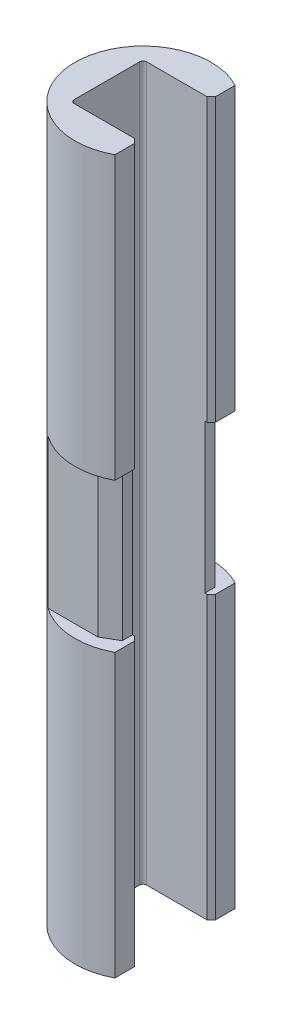
ISO-10303-21;
HEADER;
FILE_DESCRIPTION(('STEP AP214'),'2;1');
FILE_NAME('part.step','',(''),(''),'','','');
FILE_SCHEMA(('AUTOMOTIVE_DESIGN { 1 0 10303 214 1 1 1 1 }'));
ENDSEC;
DATA;
#1=APPLICATION_CONTEXT('core data for automotive mechanical design processes');
#2=APPLICATION_PROTOCOL_DEFINITION('international standard','automotive_design',2000,#1);
#3=PRODUCT_CONTEXT('',#1,'mechanical');
#4=PRODUCT('Part','Part','',(#3));
#5=PRODUCT_RELATED_PRODUCT_CATEGORY('part','',(#4));
#6=PRODUCT_DEFINITION_FORMATION('','',#4);
#7=PRODUCT_DEFINITION_CONTEXT('part definition',#1,'design');
#8=PRODUCT_DEFINITION('design','',#6,#7);
#9=PRODUCT_DEFINITION_SHAPE('','',#8);
#10=(LENGTH_UNIT() NAMED_UNIT(*) SI_UNIT(.MILLI.,.METRE.));
#11=(NAMED_UNIT(*) PLANE_ANGLE_UNIT() SI_UNIT($,.RADIAN.));
#12=(NAMED_UNIT(*) SI_UNIT($,.STERADIAN.) SOLID_ANGLE_UNIT());
#13=UNCERTAINTY_MEASURE_WITH_UNIT(LENGTH_MEASURE(1.E-05),#10,'distance_accuracy_value','');
#14=(GEOMETRIC_REPRESENTATION_CONTEXT(3) GLOBAL_UNCERTAINTY_ASSIGNED_CONTEXT((#13)) GLOBAL_UNIT_ASSIGNED_CONTEXT((#10,
#11,#12)) REPRESENTATION_CONTEXT('',''));
#15=CARTESIAN_POINT('',(0.,0.,0.));
#16=DIRECTION('',(0.,0.,1.));
#17=DIRECTION('',(1.,0.,0.));
#18=AXIS2_PLACEMENT_3D('',#15,#16,#17);
#19=CARTESIAN_POINT('',(-3.6,13.5,1.939059892));
#20=DIRECTION('',(-1.,0.,0.));
#21=DIRECTION('',(0.,0.,1.));
#22=AXIS2_PLACEMENT_3D('',#19,#20,#21);
#23=PLANE('',#22);
#24=DIRECTION('',(0.,1.,0.));
#25=VECTOR('',#24,1.);
#26=CARTESIAN_POINT('',(-3.6,13.5,2.178119784));
#27=LINE('',#26,#25);
#28=CARTESIAN_POINT('',(-3.6,20.5,2.178119784));
#29=VERTEX_POINT('',#28);
#30=CARTESIAN_POINT('',(-3.6,13.5,2.178119784));
#31=VERTEX_POINT('',#30);
#32=EDGE_CURVE('E262',#29,#31,#27,.F.);
#33=ORIENTED_EDGE('',*,*,#32,.T.);
#34=DIRECTION('',(0.,0.,1.));
#35=VECTOR('',#34,1.);
#36=CARTESIAN_POINT('',(-3.6,13.5,1.939059892));
#37=LINE('',#36,#35);
#38=CARTESIAN_POINT('',(-3.6,13.5,1.70000000233333));
#39=VERTEX_POINT('',#38);
#40=EDGE_CURVE('E194',#39,#31,#37,.T.);
#41=ORIENTED_EDGE('',*,*,#40,.F.);
#42=DIRECTION('',(0.,1.,0.));
#43=VECTOR('',#42,1.);
#44=CARTESIAN_POINT('',(-3.6,0.25,1.700000004));
#45=LINE('',#44,#43);
#46=CARTESIAN_POINT('',(-3.6,20.5,1.70000000133333));
#47=VERTEX_POINT('',#46);
#48=EDGE_CURVE('E220',#47,#39,#45,.F.);
#49=ORIENTED_EDGE('',*,*,#48,.F.);
#50=DIRECTION('',(0.,0.,1.));
#51=VECTOR('',#50,1.);
#52=CARTESIAN_POINT('',(-3.6,20.5,1.939059892));
#53=LINE('',#52,#51);
#54=EDGE_CURVE('E231',#29,#47,#53,.F.);
#55=ORIENTED_EDGE('',*,*,#54,.F.);
#56=EDGE_LOOP('',(#33,#41,#49,#55));
#57=FACE_BOUND('',#56,.T.);
#58=ADVANCED_FACE('F16',(#57),#23,.F.);
#59=CARTESIAN_POINT('',(-3.4,0.25,-1.8));
#60=DIRECTION('',(0.707106781186548,0.,0.707106781186548));
#61=DIRECTION('',(0.707106781186548,0.,-0.707106781186548));
#62=AXIS2_PLACEMENT_3D('',#59,#60,#61);
#63=PLANE('',#62);
#64=DIRECTION('',(0.707106781186548,0.,-0.707106781186548));
#65=VECTOR('',#64,1.);
#66=CARTESIAN_POINT('',(-3.4,33.75,-1.8));
#67=LINE('',#66,#65);
#68=CARTESIAN_POINT('',(-3.3,33.75,-1.9));
#69=VERTEX_POINT('',#68);
#70=CARTESIAN_POINT('',(-3.5,33.75,-1.7));
#71=VERTEX_POINT('',#70);
#72=EDGE_CURVE('E355',#69,#71,#67,.F.);
#73=ORIENTED_EDGE('',*,*,#72,.T.);
#74=DIRECTION('',(0.,1.,0.));
#75=VECTOR('',#74,1.);
#76=CARTESIAN_POINT('',(-3.5,0.25,-1.7));
#77=LINE('',#76,#75);
#78=CARTESIAN_POINT('',(-3.5,20.5,-1.7));
#79=VERTEX_POINT('',#78);
#80=EDGE_CURVE('E371',#79,#71,#77,.T.);
#81=ORIENTED_EDGE('',*,*,#80,.F.);
#82=DIRECTION('',(-0.707106781186548,0.,0.707106781186548));
#83=VECTOR('',#82,1.);
#84=CARTESIAN_POINT('',(-3.3,20.5,-1.9));
#85=LINE('',#84,#83);
#86=CARTESIAN_POINT('',(-3.3,20.5,-1.9));
#87=VERTEX_POINT('',#86);
#88=EDGE_CURVE('E312',#87,#79,#85,.T.);
#89=ORIENTED_EDGE('',*,*,#88,.F.);
#90=DIRECTION('',(0.,1.,0.));
#91=VECTOR('',#90,1.);
#92=CARTESIAN_POINT('',(-3.3,0.25,-1.9));
#93=LINE('',#92,#91);
#94=EDGE_CURVE('E349',#69,#87,#93,.F.);
#95=ORIENTED_EDGE('',*,*,#94,.F.);
#96=EDGE_LOOP('',(#73,#81,#89,#95));
#97=FACE_BOUND('',#96,.T.);
#98=ADVANCED_FACE('F536',(#97),#63,.T.);
#99=CARTESIAN_POINT('',(-3.4,0.25,-1.8));
#100=DIRECTION('',(0.707106781186548,0.,0.707106781186548));
#101=DIRECTION('',(0.707106781186548,0.,-0.707106781186548));
#102=AXIS2_PLACEMENT_3D('',#99,#100,#101);
#103=PLANE('',#102);
#104=DIRECTION('',(0.707106781186548,0.,-0.707106781186548));
#105=VECTOR('',#104,1.);
#106=CARTESIAN_POINT('',(-3.4,0.25,-1.8));
#107=LINE('',#106,#105);
#108=CARTESIAN_POINT('',(-3.5,0.25,-1.7));
#109=VERTEX_POINT('',#108);
#110=CARTESIAN_POINT('',(-3.3,0.25,-1.9));
#111=VERTEX_POINT('',#110);
#112=EDGE_CURVE('E353',#109,#111,#107,.T.);
#113=ORIENTED_EDGE('',*,*,#112,.T.);
#114=DIRECTION('',(0.,1.,0.));
#115=VECTOR('',#114,1.);
#116=CARTESIAN_POINT('',(-3.3,0.25,-1.9));
#117=LINE('',#116,#115);
#118=CARTESIAN_POINT('',(-3.3,13.5,-1.9));
#119=VERTEX_POINT('',#118);
#120=EDGE_CURVE('E300',#119,#111,#117,.F.);
#121=ORIENTED_EDGE('',*,*,#120,.F.);
#122=DIRECTION('',(-0.707106781186548,0.,0.707106781186548));
#123=VECTOR('',#122,1.);
#124=CARTESIAN_POINT('',(-3.3,13.5,-1.9));
#125=LINE('',#124,#123);
#126=CARTESIAN_POINT('',(-3.5,13.5,-1.7));
#127=VERTEX_POINT('',#126);
#128=EDGE_CURVE('E329',#119,#127,#125,.T.);
#129=ORIENTED_EDGE('',*,*,#128,.T.);
#130=DIRECTION('',(0.,1.,0.));
#131=VECTOR('',#130,1.);
#132=CARTESIAN_POINT('',(-3.5,0.25,-1.7));
#133=LINE('',#132,#131);
#134=EDGE_CURVE('E283',#109,#127,#133,.T.);
#135=ORIENTED_EDGE('',*,*,#134,.F.);
#136=EDGE_LOOP('',(#113,#121,#129,#135));
#137=FACE_BOUND('',#136,.T.);
#138=ADVANCED_FACE('F541',(#137),#103,.T.);
#139=CARTESIAN_POINT('',(-3.6,13.5,-1.939059892));
#140=DIRECTION('',(-1.,0.,0.));
#141=DIRECTION('',(0.,0.,1.));
#142=AXIS2_PLACEMENT_3D('',#139,#140,#141);
#143=PLANE('',#142);
#144=DIRECTION('',(0.,1.,0.));
#145=VECTOR('',#144,1.);
#146=CARTESIAN_POINT('',(-3.6,0.25,-1.7));
#147=LINE('',#146,#145);
#148=CARTESIAN_POINT('',(-3.6,13.5,-1.7));
#149=VERTEX_POINT('',#148);
#150=CARTESIAN_POINT('',(-3.6,20.5,-1.7));
#151=VERTEX_POINT('',#150);
#152=EDGE_CURVE('E360',#149,#151,#147,.T.);
#153=ORIENTED_EDGE('',*,*,#152,.F.);
#154=DIRECTION('',(0.,0.,-1.));
#155=VECTOR('',#154,1.);
#156=CARTESIAN_POINT('',(-3.6,13.5,0.0499443220148729));
#157=LINE('',#156,#155);
#158=CARTESIAN_POINT('',(-3.6,13.5,-2.178119784));
#159=VERTEX_POINT('',#158);
#160=EDGE_CURVE('E343',#149,#159,#157,.T.);
#161=ORIENTED_EDGE('',*,*,#160,.T.);
#162=DIRECTION('',(0.,1.,0.));
#163=VECTOR('',#162,1.);
#164=CARTESIAN_POINT('',(-3.6,13.5,-2.178119784));
#165=LINE('',#164,#163);
#166=CARTESIAN_POINT('',(-3.6,20.5,-2.178119784));
#167=VERTEX_POINT('',#166);
#168=EDGE_CURVE('E313',#159,#167,#165,.T.);
#169=ORIENTED_EDGE('',*,*,#168,.T.);
#170=DIRECTION('',(0.,0.,-1.));
#171=VECTOR('',#170,1.);
#172=CARTESIAN_POINT('',(-3.6,20.5,0.0499443220148729));
#173=LINE('',#172,#171);
#174=EDGE_CURVE('E330',#151,#167,#173,.T.);
#175=ORIENTED_EDGE('',*,*,#174,.F.);
#176=EDGE_LOOP('',(#153,#161,#169,#175));
#177=FACE_BOUND('',#176,.T.);
#178=ADVANCED_FACE('F620',(#177),#143,.F.);
#179=CARTESIAN_POINT('',(-6.34,0.25,1.540000004));
#180=DIRECTION('',(0.,1.,0.));
#181=DIRECTION('',(0.,0.,1.));
#182=AXIS2_PLACEMENT_3D('',#179,#180,#181);
#183=CYLINDRICAL_SURFACE('',#182,0.159999999999999);
#184=DIRECTION('',(0.,1.,0.));
#185=VECTOR('',#184,1.);
#186=CARTESIAN_POINT('',(-6.34,0.25,1.700000004));
#187=LINE('',#186,#185);
#188=CARTESIAN_POINT('',(-6.34,0.25,1.700000004));
#189=VERTEX_POINT('',#188);
#190=CARTESIAN_POINT('',(-6.34,33.75,1.700000004));
#191=VERTEX_POINT('',#190);
#192=EDGE_CURVE('E221',#189,#191,#187,.T.);
#193=ORIENTED_EDGE('',*,*,#192,.F.);
#194=CARTESIAN_POINT('',(-6.34,0.25,1.540000004));
#195=DIRECTION('',(0.,1.,0.));
#196=DIRECTION('',(0.,0.,1.));
#197=AXIS2_PLACEMENT_3D('',#194,#195,#196);
#198=CIRCLE('',#197,0.159999999999999);
#199=CARTESIAN_POINT('',(-6.5,0.25,1.540000004));
#200=VERTEX_POINT('',#199);
#201=EDGE_CURVE('E19',#200,#189,#198,.T.);
#202=ORIENTED_EDGE('',*,*,#201,.F.);
#203=DIRECTION('',(0.,1.,0.));
#204=VECTOR('',#203,1.);
#205=CARTESIAN_POINT('',(-6.5,0.25,1.540000004));
#206=LINE('',#205,#204);
#207=CARTESIAN_POINT('',(-6.5,33.75,1.540000004));
#208=VERTEX_POINT('',#207);
#209=EDGE_CURVE('E383',#208,#200,#206,.F.);
#210=ORIENTED_EDGE('',*,*,#209,.F.);
#211=CARTESIAN_POINT('',(-6.34,33.75,1.540000004));
#212=DIRECTION('',(0.,1.,0.));
#213=DIRECTION('',(0.,0.,1.));
#214=AXIS2_PLACEMENT_3D('',#211,#212,#213);
#215=CIRCLE('',#214,0.159999999999999);
#216=EDGE_CURVE('E431',#191,#208,#215,.F.);
#217=ORIENTED_EDGE('',*,*,#216,.F.);
#218=EDGE_LOOP('',(#193,#202,#210,#217));
#219=FACE_BOUND('',#218,.T.);
#220=ADVANCED_FACE('F437',(#219),#183,.F.);
#221=CARTESIAN_POINT('',(-6.34,0.25,-1.54));
#222=DIRECTION('',(0.,1.,0.));
#223=DIRECTION('',(0.,0.,1.));
#224=AXIS2_PLACEMENT_3D('',#221,#222,#223);
#225=CYLINDRICAL_SURFACE('',#224,0.159999999999999);
#226=DIRECTION('',(0.,1.,0.));
#227=VECTOR('',#226,1.);
#228=CARTESIAN_POINT('',(-6.5,0.25,-1.54));
#229=LINE('',#228,#227);
#230=CARTESIAN_POINT('',(-6.5,0.25,-1.54));
#231=VERTEX_POINT('',#230);
#232=CARTESIAN_POINT('',(-6.5,33.75,-1.54));
#233=VERTEX_POINT('',#232);
#234=EDGE_CURVE('E440',#231,#233,#229,.T.);
#235=ORIENTED_EDGE('',*,*,#234,.F.);
#236=CARTESIAN_POINT('',(-6.34,0.25,-1.54));
#237=DIRECTION('',(0.,1.,0.));
#238=DIRECTION('',(0.,0.,1.));
#239=AXIS2_PLACEMENT_3D('',#236,#237,#238);
#240=CIRCLE('',#239,0.159999999999999);
#241=CARTESIAN_POINT('',(-6.34,0.25,-1.7));
#242=VERTEX_POINT('',#241);
#243=EDGE_CURVE('E430',#242,#231,#240,.T.);
#244=ORIENTED_EDGE('',*,*,#243,.F.);
#245=DIRECTION('',(0.,1.,0.));
#246=VECTOR('',#245,1.);
#247=CARTESIAN_POINT('',(-6.34,0.25,-1.7));
#248=LINE('',#247,#246);
#249=CARTESIAN_POINT('',(-6.34,33.75,-1.7));
#250=VERTEX_POINT('',#249);
#251=EDGE_CURVE('E287',#250,#242,#248,.F.);
#252=ORIENTED_EDGE('',*,*,#251,.F.);
#253=CARTESIAN_POINT('',(-6.34,33.75,-1.54));
#254=DIRECTION('',(0.,1.,0.));
#255=DIRECTION('',(0.,0.,1.));
#256=AXIS2_PLACEMENT_3D('',#253,#254,#255);
#257=CIRCLE('',#256,0.159999999999999);
#258=EDGE_CURVE('E350',#233,#250,#257,.F.);
#259=ORIENTED_EDGE('',*,*,#258,.F.);
#260=EDGE_LOOP('',(#235,#244,#252,#259));
#261=FACE_BOUND('',#260,.T.);
#262=ADVANCED_FACE('F613',(#261),#225,.F.);
#263=CARTESIAN_POINT('',(-3.3,0.25,-2.363329402));
#264=DIRECTION('',(1.,0.,0.));
#265=DIRECTION('',(0.,0.,-1.));
#266=AXIS2_PLACEMENT_3D('',#263,#264,#265);
#267=PLANE('',#266);
#268=DIRECTION('',(0.,0.,-1.));
#269=VECTOR('',#268,1.);
#270=CARTESIAN_POINT('',(-3.3,33.75,-2.363329402));
#271=LINE('',#270,#269);
#272=CARTESIAN_POINT('',(-3.30000000000435,33.75,-2.82665880398131));
#273=VERTEX_POINT('',#272);
#274=EDGE_CURVE('E346',#273,#69,#271,.F.);
#275=ORIENTED_EDGE('',*,*,#274,.T.);
#276=ORIENTED_EDGE('',*,*,#94,.T.);
#277=DIRECTION('',(0.,0.,-1.));
#278=VECTOR('',#277,1.);
#279=CARTESIAN_POINT('',(-3.3,20.5,0.0499443220148729));
#280=LINE('',#279,#278);
#281=CARTESIAN_POINT('',(-3.30000000000435,20.5,-2.82665880398131));
#282=VERTEX_POINT('',#281);
#283=EDGE_CURVE('E309',#282,#87,#280,.F.);
#284=ORIENTED_EDGE('',*,*,#283,.F.);
#285=DIRECTION('',(0.,1.,0.));
#286=VECTOR('',#285,1.);
#287=CARTESIAN_POINT('',(-3.30000000000869,0.25,-2.82665880398362));
#288=LINE('',#287,#286);
#289=EDGE_CURVE('E428',#273,#282,#288,.F.);
#290=ORIENTED_EDGE('',*,*,#289,.F.);
#291=EDGE_LOOP('',(#275,#276,#284,#290));
#292=FACE_BOUND('',#291,.T.);
#293=ADVANCED_FACE('F609',(#292),#267,.T.);
#294=CARTESIAN_POINT('',(-3.965358984,13.5,-2.389059892));
#295=DIRECTION('',(-0.500000000420887,0.,0.86602540354144));
#296=DIRECTION('',(0.86602540354144,0.,0.500000000420887));
#297=AXIS2_PLACEMENT_3D('',#294,#295,#296);
#298=PLANE('',#297);
#299=ORIENTED_EDGE('',*,*,#168,.F.);
#300=DIRECTION('',(-0.866025403541439,0.,-0.500000000420887));
#301=VECTOR('',#300,1.);
#302=CARTESIAN_POINT('',(-3.6,13.5,-2.178119784));
#303=LINE('',#302,#301);
#304=CARTESIAN_POINT('',(-4.330717968,13.5,-2.6));
#305=VERTEX_POINT('',#304);
#306=EDGE_CURVE('E306',#159,#305,#303,.T.);
#307=ORIENTED_EDGE('',*,*,#306,.T.);
#308=DIRECTION('',(0.,1.,0.));
#309=VECTOR('',#308,1.);
#310=CARTESIAN_POINT('',(-4.330717968,13.5,-2.6));
#311=LINE('',#310,#309);
#312=CARTESIAN_POINT('',(-4.330717968,20.5,-2.6));
#313=VERTEX_POINT('',#312);
#314=EDGE_CURVE('E323',#305,#313,#311,.T.);
#315=ORIENTED_EDGE('',*,*,#314,.T.);
#316=DIRECTION('',(-0.866025403541439,0.,-0.500000000420887));
#317=VECTOR('',#316,1.);
#318=CARTESIAN_POINT('',(-3.6,20.5,-2.178119784));
#319=LINE('',#318,#317);
#320=EDGE_CURVE('E326',#167,#313,#319,.T.);
#321=ORIENTED_EDGE('',*,*,#320,.F.);
#322=EDGE_LOOP('',(#299,#307,#315,#321));
#323=FACE_BOUND('',#322,.T.);
#324=ADVANCED_FACE('F605',(#323),#298,.F.);
#325=CARTESIAN_POINT('',(-5.93127812531918,20.5,0.0499443220148729));
#326=DIRECTION('',(0.,-1.,0.));
#327=DIRECTION('',(0.,0.,-1.));
#328=AXIS2_PLACEMENT_3D('',#325,#326,#327);
#329=PLANE('',#328);
#330=DIRECTION('',(1.,0.,0.));
#331=VECTOR('',#330,1.);
#332=CARTESIAN_POINT('',(-6.1,20.5,-2.6));
#333=LINE('',#332,#331);
#334=CARTESIAN_POINT('',(-6.66547580903961,20.5,-2.6));
#335=VERTEX_POINT('',#334);
#336=EDGE_CURVE('E320',#313,#335,#333,.F.);
#337=ORIENTED_EDGE('',*,*,#336,.T.);
#338=CARTESIAN_POINT('',(-4.8,20.5,0.));
#339=DIRECTION('',(0.,1.,0.));
#340=DIRECTION('',(0.,0.,1.));
#341=AXIS2_PLACEMENT_3D('',#338,#339,#340);
#342=CIRCLE('',#341,3.19999999908);
#343=EDGE_CURVE('E339',#282,#335,#342,.T.);
#344=ORIENTED_EDGE('',*,*,#343,.F.);
#345=ORIENTED_EDGE('',*,*,#283,.T.);
#346=ORIENTED_EDGE('',*,*,#88,.T.);
#347=DIRECTION('',(1.,0.,0.));
#348=VECTOR('',#347,1.);
#349=CARTESIAN_POINT('',(-4.92,20.5,-1.7));
#350=LINE('',#349,#348);
#351=EDGE_CURVE('E244',#151,#79,#350,.T.);
#352=ORIENTED_EDGE('',*,*,#351,.F.);
#353=ORIENTED_EDGE('',*,*,#174,.T.);
#354=ORIENTED_EDGE('',*,*,#320,.T.);
#355=EDGE_LOOP('',(#337,#344,#345,#346,#352,#353,#354));
#356=FACE_BOUND('',#355,.T.);
#357=ADVANCED_FACE('F601',(#356),#329,.T.);
#358=CARTESIAN_POINT('',(-5.93127812531918,13.5,0.0499443220148729));
#359=DIRECTION('',(0.,-1.,0.));
#360=DIRECTION('',(0.,0.,-1.));
#361=AXIS2_PLACEMENT_3D('',#358,#359,#360);
#362=PLANE('',#361);
#363=DIRECTION('',(1.,0.,0.));
#364=VECTOR('',#363,1.);
#365=CARTESIAN_POINT('',(-6.1,13.5,-2.6));
#366=LINE('',#365,#364);
#367=CARTESIAN_POINT('',(-6.66547580903961,13.5,-2.6));
#368=VERTEX_POINT('',#367);
#369=EDGE_CURVE('E334',#368,#305,#366,.T.);
#370=ORIENTED_EDGE('',*,*,#369,.T.);
#371=ORIENTED_EDGE('',*,*,#306,.F.);
#372=ORIENTED_EDGE('',*,*,#160,.F.);
#373=DIRECTION('',(1.,0.,0.));
#374=VECTOR('',#373,1.);
#375=CARTESIAN_POINT('',(-4.92,13.5,-1.7));
#376=LINE('',#375,#374);
#377=EDGE_CURVE('E286',#127,#149,#376,.F.);
#378=ORIENTED_EDGE('',*,*,#377,.F.);
#379=ORIENTED_EDGE('',*,*,#128,.F.);
#380=DIRECTION('',(0.,0.,-1.));
#381=VECTOR('',#380,1.);
#382=CARTESIAN_POINT('',(-3.3,13.5,-2.363329402));
#383=LINE('',#382,#381);
#384=CARTESIAN_POINT('',(-3.30000000000435,13.5,-2.82665880398131));
#385=VERTEX_POINT('',#384);
#386=EDGE_CURVE('E303',#385,#119,#383,.F.);
#387=ORIENTED_EDGE('',*,*,#386,.F.);
#388=CARTESIAN_POINT('',(-4.8,13.5,0.));
#389=DIRECTION('',(0.,1.,0.));
#390=DIRECTION('',(0.,0.,1.));
#391=AXIS2_PLACEMENT_3D('',#388,#389,#390);
#392=CIRCLE('',#391,3.19999999908);
#393=EDGE_CURVE('E294',#368,#385,#392,.F.);
#394=ORIENTED_EDGE('',*,*,#393,.F.);
#395=EDGE_LOOP('',(#370,#371,#372,#378,#379,#387,#394));
#396=FACE_BOUND('',#395,.T.);
#397=ADVANCED_FACE('F597',(#396),#362,.F.);
#398=CARTESIAN_POINT('',(-3.3,0.25,-2.363329402));
#399=DIRECTION('',(1.,0.,0.));
#400=DIRECTION('',(0.,0.,-1.));
#401=AXIS2_PLACEMENT_3D('',#398,#399,#400);
#402=PLANE('',#401);
#403=DIRECTION('',(0.,0.,-1.));
#404=VECTOR('',#403,1.);
#405=CARTESIAN_POINT('',(-3.3,0.25,-2.363329402));
#406=LINE('',#405,#404);
#407=CARTESIAN_POINT('',(-3.30000000000435,0.25,-2.82665880398131));
#408=VERTEX_POINT('',#407);
#409=EDGE_CURVE('E275',#111,#408,#406,.T.);
#410=ORIENTED_EDGE('',*,*,#409,.T.);
#411=DIRECTION('',(0.,1.,0.));
#412=VECTOR('',#411,1.);
#413=CARTESIAN_POINT('',(-3.30000000000869,0.25,-2.82665880398362));
#414=LINE('',#413,#412);
#415=EDGE_CURVE('E290',#385,#408,#414,.F.);
#416=ORIENTED_EDGE('',*,*,#415,.F.);
#417=ORIENTED_EDGE('',*,*,#386,.T.);
#418=ORIENTED_EDGE('',*,*,#120,.T.);
#419=EDGE_LOOP('',(#410,#416,#417,#418));
#420=FACE_BOUND('',#419,.T.);
#421=ADVANCED_FACE('F594',(#420),#402,.T.);
#422=CARTESIAN_POINT('',(-3.4,0.25,1.800000004));
#423=DIRECTION('',(0.707106781186548,0.,-0.707106781186548));
#424=DIRECTION('',(-0.707106781186548,0.,-0.707106781186548));
#425=AXIS2_PLACEMENT_3D('',#422,#423,#424);
#426=PLANE('',#425);
#427=DIRECTION('',(0.707106781186548,0.,0.707106781186547));
#428=VECTOR('',#427,1.);
#429=CARTESIAN_POINT('',(-3.5,0.25,1.700000004));
#430=LINE('',#429,#428);
#431=CARTESIAN_POINT('',(-3.50000000133333,0.25,1.700000004));
#432=VERTEX_POINT('',#431);
#433=CARTESIAN_POINT('',(-3.3,0.25,1.900000004));
#434=VERTEX_POINT('',#433);
#435=EDGE_CURVE('E197',#432,#434,#430,.T.);
#436=ORIENTED_EDGE('',*,*,#435,.F.);
#437=DIRECTION('',(0.,1.,0.));
#438=VECTOR('',#437,1.);
#439=CARTESIAN_POINT('',(-3.500000004,0.25,1.700000004));
#440=LINE('',#439,#438);
#441=CARTESIAN_POINT('',(-3.50000000266667,13.5,1.70000000266667));
#442=VERTEX_POINT('',#441);
#443=EDGE_CURVE('E126',#442,#432,#440,.F.);
#444=ORIENTED_EDGE('',*,*,#443,.F.);
#445=DIRECTION('',(-0.707106781186548,0.,-0.707106781186548));
#446=VECTOR('',#445,1.);
#447=CARTESIAN_POINT('',(-3.4,13.5,1.800000004));
#448=LINE('',#447,#446);
#449=CARTESIAN_POINT('',(-3.3,13.5,1.900000004));
#450=VERTEX_POINT('',#449);
#451=EDGE_CURVE('E271',#442,#450,#448,.F.);
#452=ORIENTED_EDGE('',*,*,#451,.T.);
#453=DIRECTION('',(0.,1.,0.));
#454=VECTOR('',#453,1.);
#455=CARTESIAN_POINT('',(-3.3,0.25,1.900000004));
#456=LINE('',#455,#454);
#457=EDGE_CURVE('E256',#434,#450,#456,.T.);
#458=ORIENTED_EDGE('',*,*,#457,.F.);
#459=EDGE_LOOP('',(#436,#444,#452,#458));
#460=FACE_BOUND('',#459,.T.);
#461=ADVANCED_FACE('F533',(#460),#426,.T.);
#462=CARTESIAN_POINT('',(-3.965358984,13.5,2.389059892));
#463=DIRECTION('',(-0.500000000420887,0.,-0.86602540354144));
#464=DIRECTION('',(-0.86602540354144,0.,0.500000000420887));
#465=AXIS2_PLACEMENT_3D('',#462,#463,#464);
#466=PLANE('',#465);
#467=DIRECTION('',(0.,1.,0.));
#468=VECTOR('',#467,1.);
#469=CARTESIAN_POINT('',(-4.330717968,13.5,2.6));
#470=LINE('',#469,#468);
#471=CARTESIAN_POINT('',(-4.330717968,20.5,2.6));
#472=VERTEX_POINT('',#471);
#473=CARTESIAN_POINT('',(-4.330717968,13.5,2.6));
#474=VERTEX_POINT('',#473);
#475=EDGE_CURVE('E247',#472,#474,#470,.F.);
#476=ORIENTED_EDGE('',*,*,#475,.T.);
#477=DIRECTION('',(0.866025403541439,0.,-0.500000000420887));
#478=VECTOR('',#477,1.);
#479=CARTESIAN_POINT('',(-4.330717968,13.5,2.6));
#480=LINE('',#479,#478);
#481=EDGE_CURVE('E252',#474,#31,#480,.T.);
#482=ORIENTED_EDGE('',*,*,#481,.T.);
#483=ORIENTED_EDGE('',*,*,#32,.F.);
#484=DIRECTION('',(-0.86602540354144,0.,0.500000000420887));
#485=VECTOR('',#484,1.);
#486=CARTESIAN_POINT('',(-3.965358984,20.5,2.389059892));
#487=LINE('',#486,#485);
#488=EDGE_CURVE('E259',#472,#29,#487,.F.);
#489=ORIENTED_EDGE('',*,*,#488,.F.);
#490=EDGE_LOOP('',(#476,#482,#483,#489));
#491=FACE_BOUND('',#490,.T.);
#492=ADVANCED_FACE('F525',(#491),#466,.F.);
#493=CARTESIAN_POINT('',(-3.4,0.25,1.800000004));
#494=DIRECTION('',(0.707106781186548,0.,-0.707106781186548));
#495=DIRECTION('',(-0.707106781186548,0.,-0.707106781186548));
#496=AXIS2_PLACEMENT_3D('',#493,#494,#495);
#497=PLANE('',#496);
#498=DIRECTION('',(-0.707106781186548,0.,-0.707106781186548));
#499=VECTOR('',#498,1.);
#500=CARTESIAN_POINT('',(-3.4,33.75,1.800000004));
#501=LINE('',#500,#499);
#502=CARTESIAN_POINT('',(-3.50000000133333,33.75,1.70000000266667));
#503=VERTEX_POINT('',#502);
#504=CARTESIAN_POINT('',(-3.3,33.75,1.900000004));
#505=VERTEX_POINT('',#504);
#506=EDGE_CURVE('E261',#503,#505,#501,.F.);
#507=ORIENTED_EDGE('',*,*,#506,.T.);
#508=DIRECTION('',(0.,1.,0.));
#509=VECTOR('',#508,1.);
#510=CARTESIAN_POINT('',(-3.3,0.25,1.900000004));
#511=LINE('',#510,#509);
#512=CARTESIAN_POINT('',(-3.3,20.5,1.900000004));
#513=VERTEX_POINT('',#512);
#514=EDGE_CURVE('E225',#513,#505,#511,.T.);
#515=ORIENTED_EDGE('',*,*,#514,.F.);
#516=DIRECTION('',(0.707106781186547,0.,0.707106781186547));
#517=VECTOR('',#516,1.);
#518=CARTESIAN_POINT('',(-3.500000004,20.5,1.7));
#519=LINE('',#518,#517);
#520=CARTESIAN_POINT('',(-3.50000000266667,20.5,1.70000000133333));
#521=VERTEX_POINT('',#520);
#522=EDGE_CURVE('E206',#521,#513,#519,.T.);
#523=ORIENTED_EDGE('',*,*,#522,.F.);
#524=DIRECTION('',(0.,1.,0.));
#525=VECTOR('',#524,1.);
#526=CARTESIAN_POINT('',(-3.5,0.25,1.700000004));
#527=LINE('',#526,#525);
#528=EDGE_CURVE('E212',#503,#521,#527,.F.);
#529=ORIENTED_EDGE('',*,*,#528,.F.);
#530=EDGE_LOOP('',(#507,#515,#523,#529));
#531=FACE_BOUND('',#530,.T.);
#532=ADVANCED_FACE('F223',(#531),#497,.T.);
#533=CARTESIAN_POINT('',(-4.92,0.25,1.700000004));
#534=DIRECTION('',(0.,0.,-1.));
#535=DIRECTION('',(-1.,0.,0.));
#536=AXIS2_PLACEMENT_3D('',#533,#534,#535);
#537=PLANE('',#536);
#538=DIRECTION('',(1.,0.,0.));
#539=VECTOR('',#538,1.);
#540=CARTESIAN_POINT('',(-5.93127812531918,20.5,1.7));
#541=LINE('',#540,#539);
#542=EDGE_CURVE('E215',#47,#521,#541,.T.);
#543=ORIENTED_EDGE('',*,*,#542,.F.);
#544=ORIENTED_EDGE('',*,*,#48,.T.);
#545=DIRECTION('',(1.,0.,0.));
#546=VECTOR('',#545,1.);
#547=CARTESIAN_POINT('',(-5.93127812531918,13.5,1.7));
#548=LINE('',#547,#546);
#549=EDGE_CURVE('E255',#39,#442,#548,.T.);
#550=ORIENTED_EDGE('',*,*,#549,.T.);
#551=ORIENTED_EDGE('',*,*,#443,.T.);
#552=DIRECTION('',(1.,0.,0.));
#553=VECTOR('',#552,1.);
#554=CARTESIAN_POINT('',(-5.50749127267327,0.25,1.700000004));
#555=LINE('',#554,#553);
#556=EDGE_CURVE('E280',#189,#432,#555,.T.);
#557=ORIENTED_EDGE('',*,*,#556,.F.);
#558=ORIENTED_EDGE('',*,*,#192,.T.);
#559=DIRECTION('',(1.,0.,0.));
#560=VECTOR('',#559,1.);
#561=CARTESIAN_POINT('',(-5.50749127267327,33.75,1.700000004));
#562=LINE('',#561,#560);
#563=EDGE_CURVE('E218',#191,#503,#562,.T.);
#564=ORIENTED_EDGE('',*,*,#563,.T.);
#565=ORIENTED_EDGE('',*,*,#528,.T.);
#566=EDGE_LOOP('',(#543,#544,#550,#551,#557,#558,#564,#565));
#567=FACE_BOUND('',#566,.T.);
#568=ADVANCED_FACE('F213',(#567),#537,.T.);
#569=CARTESIAN_POINT('',(-4.92,0.25,-1.7));
#570=DIRECTION('',(0.,0.,1.));
#571=DIRECTION('',(1.,0.,0.));
#572=AXIS2_PLACEMENT_3D('',#569,#570,#571);
#573=PLANE('',#572);
#574=ORIENTED_EDGE('',*,*,#377,.T.);
#575=ORIENTED_EDGE('',*,*,#152,.T.);
#576=ORIENTED_EDGE('',*,*,#351,.T.);
#577=ORIENTED_EDGE('',*,*,#80,.T.);
#578=DIRECTION('',(1.,0.,0.));
#579=VECTOR('',#578,1.);
#580=CARTESIAN_POINT('',(-5.50749127267327,33.75,-1.7));
#581=LINE('',#580,#579);
#582=EDGE_CURVE('E446',#71,#250,#581,.F.);
#583=ORIENTED_EDGE('',*,*,#582,.T.);
#584=ORIENTED_EDGE('',*,*,#251,.T.);
#585=DIRECTION('',(1.,0.,0.));
#586=VECTOR('',#585,1.);
#587=CARTESIAN_POINT('',(-5.50749127267327,0.25,-1.7));
#588=LINE('',#587,#586);
#589=EDGE_CURVE('E279',#109,#242,#588,.F.);
#590=ORIENTED_EDGE('',*,*,#589,.F.);
#591=ORIENTED_EDGE('',*,*,#134,.T.);
#592=EDGE_LOOP('',(#574,#575,#576,#577,#583,#584,#590,#591));
#593=FACE_BOUND('',#592,.T.);
#594=ADVANCED_FACE('F582',(#593),#573,.T.);
#595=CARTESIAN_POINT('',(-6.5,0.25,0.770000002000001));
#596=DIRECTION('',(1.,0.,0.));
#597=DIRECTION('',(0.,0.,-1.));
#598=AXIS2_PLACEMENT_3D('',#595,#596,#597);
#599=PLANE('',#598);
#600=DIRECTION('',(0.,0.,-1.));
#601=VECTOR('',#600,1.);
#602=CARTESIAN_POINT('',(-6.5,0.25,4.13261691534217E-10));
#603=LINE('',#602,#601);
#604=EDGE_CURVE('E293',#231,#200,#603,.F.);
#605=ORIENTED_EDGE('',*,*,#604,.F.);
#606=ORIENTED_EDGE('',*,*,#234,.T.);
#607=DIRECTION('',(0.,0.,-1.));
#608=VECTOR('',#607,1.);
#609=CARTESIAN_POINT('',(-6.5,33.75,4.13261658227527E-10));
#610=LINE('',#609,#608);
#611=EDGE_CURVE('E436',#233,#208,#610,.F.);
#612=ORIENTED_EDGE('',*,*,#611,.T.);
#613=ORIENTED_EDGE('',*,*,#209,.T.);
#614=EDGE_LOOP('',(#605,#606,#612,#613));
#615=FACE_BOUND('',#614,.T.);
#616=ADVANCED_FACE('F443',(#615),#599,.T.);
#617=CARTESIAN_POINT('',(-6.1,13.5,-2.6));
#618=DIRECTION('',(0.,0.,1.));
#619=DIRECTION('',(1.,0.,0.));
#620=AXIS2_PLACEMENT_3D('',#617,#618,#619);
#621=PLANE('',#620);
#622=ORIENTED_EDGE('',*,*,#336,.F.);
#623=ORIENTED_EDGE('',*,*,#314,.F.);
#624=ORIENTED_EDGE('',*,*,#369,.F.);
#625=DIRECTION('',(0.,1.,0.));
#626=VECTOR('',#625,1.);
#627=CARTESIAN_POINT('',(-6.66547580903961,0.25,-2.6));
#628=LINE('',#627,#626);
#629=EDGE_CURVE('E316',#335,#368,#628,.F.);
#630=ORIENTED_EDGE('',*,*,#629,.F.);
#631=EDGE_LOOP('',(#622,#623,#624,#630));
#632=FACE_BOUND('',#631,.T.);
#633=ADVANCED_FACE('F576',(#632),#621,.F.);
#634=CARTESIAN_POINT('',(-5.50749127267327,0.25,4.13261691534217E-10));
#635=DIRECTION('',(0.,-1.,0.));
#636=DIRECTION('',(0.,0.,-1.));
#637=AXIS2_PLACEMENT_3D('',#634,#635,#636);
#638=PLANE('',#637);
#639=ORIENTED_EDGE('',*,*,#589,.T.);
#640=ORIENTED_EDGE('',*,*,#243,.T.);
#641=ORIENTED_EDGE('',*,*,#604,.T.);
#642=ORIENTED_EDGE('',*,*,#201,.T.);
#643=ORIENTED_EDGE('',*,*,#556,.T.);
#644=ORIENTED_EDGE('',*,*,#435,.T.);
#645=DIRECTION('',(0.,0.,-1.));
#646=VECTOR('',#645,1.);
#647=CARTESIAN_POINT('',(-3.3,0.25,2.36332940443093));
#648=LINE('',#647,#646);
#649=CARTESIAN_POINT('',(-3.30000000083184,0.25,2.82665880442043));
#650=VERTEX_POINT('',#649);
#651=EDGE_CURVE('E267',#650,#434,#648,.T.);
#652=ORIENTED_EDGE('',*,*,#651,.F.);
#653=CARTESIAN_POINT('',(-4.8,0.25,0.));
#654=DIRECTION('',(0.,1.,0.));
#655=DIRECTION('',(0.,0.,1.));
#656=AXIS2_PLACEMENT_3D('',#653,#654,#655);
#657=CIRCLE('',#656,3.19999999908);
#658=EDGE_CURVE('E319',#408,#650,#657,.T.);
#659=ORIENTED_EDGE('',*,*,#658,.F.);
#660=ORIENTED_EDGE('',*,*,#409,.F.);
#661=ORIENTED_EDGE('',*,*,#112,.F.);
#662=EDGE_LOOP('',(#639,#640,#641,#642,#643,#644,#652,#659,#660,#661));
#663=FACE_BOUND('',#662,.T.);
#664=ADVANCED_FACE('F573',(#663),#638,.T.);
#665=CARTESIAN_POINT('',(-3.3,0.25,2.36332940443093));
#666=DIRECTION('',(1.,0.,0.));
#667=DIRECTION('',(0.,0.,-1.));
#668=AXIS2_PLACEMENT_3D('',#665,#666,#667);
#669=PLANE('',#668);
#670=ORIENTED_EDGE('',*,*,#651,.T.);
#671=ORIENTED_EDGE('',*,*,#457,.T.);
#672=DIRECTION('',(0.,0.,-1.));
#673=VECTOR('',#672,1.);
#674=CARTESIAN_POINT('',(-3.3,13.5,0.0499443220148729));
#675=LINE('',#674,#673);
#676=CARTESIAN_POINT('',(-3.30000000083184,13.5,2.82665880442043));
#677=VERTEX_POINT('',#676);
#678=EDGE_CURVE('E249',#450,#677,#675,.F.);
#679=ORIENTED_EDGE('',*,*,#678,.T.);
#680=DIRECTION('',(0.,1.,0.));
#681=VECTOR('',#680,1.);
#682=CARTESIAN_POINT('',(-3.30000000166368,0.25,2.82665880486186));
#683=LINE('',#682,#681);
#684=EDGE_CURVE('E422',#650,#677,#683,.T.);
#685=ORIENTED_EDGE('',*,*,#684,.F.);
#686=EDGE_LOOP('',(#670,#671,#679,#685));
#687=FACE_BOUND('',#686,.T.);
#688=ADVANCED_FACE('F531',(#687),#669,.T.);
#689=CARTESIAN_POINT('',(-5.93127812531918,13.5,0.0499443220148729));
#690=DIRECTION('',(0.,-1.,0.));
#691=DIRECTION('',(0.,0.,-1.));
#692=AXIS2_PLACEMENT_3D('',#689,#690,#691);
#693=PLANE('',#692);
#694=ORIENTED_EDGE('',*,*,#678,.F.);
#695=ORIENTED_EDGE('',*,*,#451,.F.);
#696=ORIENTED_EDGE('',*,*,#549,.F.);
#697=ORIENTED_EDGE('',*,*,#40,.T.);
#698=ORIENTED_EDGE('',*,*,#481,.F.);
#699=DIRECTION('',(-1.,0.,0.));
#700=VECTOR('',#699,1.);
#701=CARTESIAN_POINT('',(-4.565358984,13.5,2.6));
#702=LINE('',#701,#700);
#703=CARTESIAN_POINT('',(-6.66547580903961,13.5,2.6));
#704=VERTEX_POINT('',#703);
#705=EDGE_CURVE('E236',#474,#704,#702,.T.);
#706=ORIENTED_EDGE('',*,*,#705,.T.);
#707=CARTESIAN_POINT('',(-4.8,13.5,0.));
#708=DIRECTION('',(0.,1.,0.));
#709=DIRECTION('',(0.,0.,1.));
#710=AXIS2_PLACEMENT_3D('',#707,#708,#709);
#711=CIRCLE('',#710,3.19999999908);
#712=EDGE_CURVE('E419',#677,#704,#711,.F.);
#713=ORIENTED_EDGE('',*,*,#712,.F.);
#714=EDGE_LOOP('',(#694,#695,#696,#697,#698,#706,#713));
#715=FACE_BOUND('',#714,.T.);
#716=ADVANCED_FACE('F527',(#715),#693,.F.);
#717=CARTESIAN_POINT('',(-4.565358984,13.5,2.6));
#718=DIRECTION('',(0.,0.,-1.));
#719=DIRECTION('',(-1.,0.,0.));
#720=AXIS2_PLACEMENT_3D('',#717,#718,#719);
#721=PLANE('',#720);
#722=ORIENTED_EDGE('',*,*,#705,.F.);
#723=ORIENTED_EDGE('',*,*,#475,.F.);
#724=DIRECTION('',(1.,0.,0.));
#725=VECTOR('',#724,1.);
#726=CARTESIAN_POINT('',(-5.93127812531918,20.5,2.6));
#727=LINE('',#726,#725);
#728=CARTESIAN_POINT('',(-6.66547580903961,20.5,2.6));
#729=VERTEX_POINT('',#728);
#730=EDGE_CURVE('E233',#729,#472,#727,.T.);
#731=ORIENTED_EDGE('',*,*,#730,.F.);
#732=DIRECTION('',(0.,1.,0.));
#733=VECTOR('',#732,1.);
#734=CARTESIAN_POINT('',(-6.66547580903961,0.25,2.6));
#735=LINE('',#734,#733);
#736=EDGE_CURVE('E418',#704,#729,#735,.T.);
#737=ORIENTED_EDGE('',*,*,#736,.F.);
#738=EDGE_LOOP('',(#722,#723,#731,#737));
#739=FACE_BOUND('',#738,.T.);
#740=ADVANCED_FACE('F523',(#739),#721,.F.);
#741=CARTESIAN_POINT('',(-5.93127812531918,20.5,0.0499443220148729));
#742=DIRECTION('',(0.,-1.,0.));
#743=DIRECTION('',(0.,0.,-1.));
#744=AXIS2_PLACEMENT_3D('',#741,#742,#743);
#745=PLANE('',#744);
#746=ORIENTED_EDGE('',*,*,#522,.T.);
#747=DIRECTION('',(0.,0.,-1.));
#748=VECTOR('',#747,1.);
#749=CARTESIAN_POINT('',(-3.3,20.5,2.36332940443093));
#750=LINE('',#749,#748);
#751=CARTESIAN_POINT('',(-3.30000000083184,20.5,2.82665880442043));
#752=VERTEX_POINT('',#751);
#753=EDGE_CURVE('E227',#752,#513,#750,.T.);
#754=ORIENTED_EDGE('',*,*,#753,.F.);
#755=CARTESIAN_POINT('',(-4.8,20.5,0.));
#756=DIRECTION('',(0.,1.,0.));
#757=DIRECTION('',(0.,0.,1.));
#758=AXIS2_PLACEMENT_3D('',#755,#756,#757);
#759=CIRCLE('',#758,3.19999999908);
#760=EDGE_CURVE('E415',#729,#752,#759,.T.);
#761=ORIENTED_EDGE('',*,*,#760,.F.);
#762=ORIENTED_EDGE('',*,*,#730,.T.);
#763=ORIENTED_EDGE('',*,*,#488,.T.);
#764=ORIENTED_EDGE('',*,*,#54,.T.);
#765=ORIENTED_EDGE('',*,*,#542,.T.);
#766=EDGE_LOOP('',(#746,#754,#761,#762,#763,#764,#765));
#767=FACE_BOUND('',#766,.T.);
#768=ADVANCED_FACE('F229',(#767),#745,.T.);
#769=CARTESIAN_POINT('',(-3.3,0.25,2.36332940443093));
#770=DIRECTION('',(1.,0.,0.));
#771=DIRECTION('',(0.,0.,-1.));
#772=AXIS2_PLACEMENT_3D('',#769,#770,#771);
#773=PLANE('',#772);
#774=DIRECTION('',(0.,0.,-1.));
#775=VECTOR('',#774,1.);
#776=CARTESIAN_POINT('',(-3.3,33.75,4.13261658227527E-10));
#777=LINE('',#776,#775);
#778=CARTESIAN_POINT('',(-3.30000000083184,33.75,2.82665880442043));
#779=VERTEX_POINT('',#778);
#780=EDGE_CURVE('E450',#505,#779,#777,.F.);
#781=ORIENTED_EDGE('',*,*,#780,.T.);
#782=DIRECTION('',(0.,1.,0.));
#783=VECTOR('',#782,1.);
#784=CARTESIAN_POINT('',(-3.30000000166368,0.25,2.82665880486186));
#785=LINE('',#784,#783);
#786=EDGE_CURVE('E414',#752,#779,#785,.T.);
#787=ORIENTED_EDGE('',*,*,#786,.F.);
#788=ORIENTED_EDGE('',*,*,#753,.T.);
#789=ORIENTED_EDGE('',*,*,#514,.T.);
#790=EDGE_LOOP('',(#781,#787,#788,#789));
#791=FACE_BOUND('',#790,.T.);
#792=ADVANCED_FACE('F510',(#791),#773,.T.);
#793=CARTESIAN_POINT('',(-5.50749127267327,33.75,4.13261658227527E-10));
#794=DIRECTION('',(0.,-1.,0.));
#795=DIRECTION('',(0.,0.,-1.));
#796=AXIS2_PLACEMENT_3D('',#793,#794,#795);
#797=PLANE('',#796);
#798=ORIENTED_EDGE('',*,*,#258,.T.);
#799=ORIENTED_EDGE('',*,*,#582,.F.);
#800=ORIENTED_EDGE('',*,*,#72,.F.);
#801=ORIENTED_EDGE('',*,*,#274,.F.);
#802=CARTESIAN_POINT('',(-4.8,33.75,0.));
#803=DIRECTION('',(0.,1.,0.));
#804=DIRECTION('',(0.,0.,1.));
#805=AXIS2_PLACEMENT_3D('',#802,#803,#804);
#806=CIRCLE('',#805,3.19999999908);
#807=EDGE_CURVE('E412',#779,#273,#806,.F.);
#808=ORIENTED_EDGE('',*,*,#807,.F.);
#809=ORIENTED_EDGE('',*,*,#780,.F.);
#810=ORIENTED_EDGE('',*,*,#506,.F.);
#811=ORIENTED_EDGE('',*,*,#563,.F.);
#812=ORIENTED_EDGE('',*,*,#216,.T.);
#813=ORIENTED_EDGE('',*,*,#611,.F.);
#814=EDGE_LOOP('',(#798,#799,#800,#801,#808,#809,#810,#811,#812,#813));
#815=FACE_BOUND('',#814,.T.);
#816=ADVANCED_FACE('F434',(#815),#797,.F.);
#817=CARTESIAN_POINT('',(-5.93127812531918,20.5,0.0499443220148729));
#818=DIRECTION('',(0.,-1.,0.));
#819=DIRECTION('',(0.,0.,-1.));
#820=AXIS2_PLACEMENT_3D('',#817,#818,#819);
#821=PLANE('',#820);
#822=CARTESIAN_POINT('',(-4.8,20.5,0.));
#823=DIRECTION('',(0.,1.,0.));
#824=DIRECTION('',(0.,0.,1.));
#825=AXIS2_PLACEMENT_3D('',#822,#823,#824);
#826=CIRCLE('',#825,3.19999999908);
#827=CARTESIAN_POINT('',(-7.4,20.5,-1.86547580903961));
#828=VERTEX_POINT('',#827);
#829=CARTESIAN_POINT('',(-7.4,20.5,1.86547580903961));
#830=VERTEX_POINT('',#829);
#831=EDGE_CURVE('E408',#828,#830,#826,.T.);
#832=ORIENTED_EDGE('',*,*,#831,.F.);
#833=DIRECTION('',(0.,0.,-1.));
#834=VECTOR('',#833,1.);
#835=CARTESIAN_POINT('',(-7.4,20.5,1.3));
#836=LINE('',#835,#834);
#837=EDGE_CURVE('E445',#828,#830,#836,.F.);
#838=ORIENTED_EDGE('',*,*,#837,.T.);
#839=EDGE_LOOP('',(#832,#838));
#840=FACE_BOUND('',#839,.T.);
#841=ADVANCED_FACE('F557',(#840),#821,.T.);
#842=CARTESIAN_POINT('',(-7.4,13.5,1.3));
#843=DIRECTION('',(1.,0.,0.));
#844=DIRECTION('',(0.,0.,-1.));
#845=AXIS2_PLACEMENT_3D('',#842,#843,#844);
#846=PLANE('',#845);
#847=ORIENTED_EDGE('',*,*,#837,.F.);
#848=DIRECTION('',(0.,1.,0.));
#849=VECTOR('',#848,1.);
#850=CARTESIAN_POINT('',(-7.4,0.25,-1.86547580903961));
#851=LINE('',#850,#849);
#852=CARTESIAN_POINT('',(-7.4,13.5,-1.86547580903961));
#853=VERTEX_POINT('',#852);
#854=EDGE_CURVE('E411',#853,#828,#851,.T.);
#855=ORIENTED_EDGE('',*,*,#854,.F.);
#856=DIRECTION('',(0.,0.,-1.));
#857=VECTOR('',#856,1.);
#858=CARTESIAN_POINT('',(-7.4,13.5,0.0499443220148729));
#859=LINE('',#858,#857);
#860=CARTESIAN_POINT('',(-7.4,13.5,1.86547580903961));
#861=VERTEX_POINT('',#860);
#862=EDGE_CURVE('E34',#853,#861,#859,.F.);
#863=ORIENTED_EDGE('',*,*,#862,.T.);
#864=DIRECTION('',(0.,1.,0.));
#865=VECTOR('',#864,1.);
#866=CARTESIAN_POINT('',(-7.4,0.25,1.86547580903961));
#867=LINE('',#866,#865);
#868=EDGE_CURVE('E25',#830,#861,#867,.F.);
#869=ORIENTED_EDGE('',*,*,#868,.F.);
#870=EDGE_LOOP('',(#847,#855,#863,#869));
#871=FACE_BOUND('',#870,.T.);
#872=ADVANCED_FACE('F550',(#871),#846,.F.);
#873=CARTESIAN_POINT('',(-5.93127812531918,13.5,0.0499443220148729));
#874=DIRECTION('',(0.,-1.,0.));
#875=DIRECTION('',(0.,0.,-1.));
#876=AXIS2_PLACEMENT_3D('',#873,#874,#875);
#877=PLANE('',#876);
#878=ORIENTED_EDGE('',*,*,#862,.F.);
#879=CARTESIAN_POINT('',(-4.8,13.5,0.));
#880=DIRECTION('',(0.,1.,0.));
#881=DIRECTION('',(0.,0.,1.));
#882=AXIS2_PLACEMENT_3D('',#879,#880,#881);
#883=CIRCLE('',#882,3.19999999908);
#884=EDGE_CURVE('E11',#861,#853,#883,.F.);
#885=ORIENTED_EDGE('',*,*,#884,.F.);
#886=EDGE_LOOP('',(#878,#885));
#887=FACE_BOUND('',#886,.T.);
#888=ADVANCED_FACE('F544',(#887),#877,.F.);
#889=CARTESIAN_POINT('',(-4.8,0.25,0.));
#890=DIRECTION('',(0.,1.,0.));
#891=DIRECTION('',(0.,0.,1.));
#892=AXIS2_PLACEMENT_3D('',#889,#890,#891);
#893=CYLINDRICAL_SURFACE('',#892,3.19999999908);
#894=ORIENTED_EDGE('',*,*,#868,.T.);
#895=ORIENTED_EDGE('',*,*,#884,.T.);
#896=ORIENTED_EDGE('',*,*,#854,.T.);
#897=ORIENTED_EDGE('',*,*,#831,.T.);
#898=EDGE_LOOP('',(#894,#895,#896,#897));
#899=FACE_BOUND('',#898,.T.);
#900=ORIENTED_EDGE('',*,*,#786,.T.);
#901=ORIENTED_EDGE('',*,*,#807,.T.);
#902=ORIENTED_EDGE('',*,*,#289,.T.);
#903=ORIENTED_EDGE('',*,*,#343,.T.);
#904=ORIENTED_EDGE('',*,*,#629,.T.);
#905=ORIENTED_EDGE('',*,*,#393,.T.);
#906=ORIENTED_EDGE('',*,*,#415,.T.);
#907=ORIENTED_EDGE('',*,*,#658,.T.);
#908=ORIENTED_EDGE('',*,*,#684,.T.);
#909=ORIENTED_EDGE('',*,*,#712,.T.);
#910=ORIENTED_EDGE('',*,*,#736,.T.);
#911=ORIENTED_EDGE('',*,*,#760,.T.);
#912=EDGE_LOOP('',(#900,#901,#902,#903,#904,#905,#906,#907,#908,#909,#910,#911));
#913=FACE_BOUND('',#912,.T.);
#914=ADVANCED_FACE('F516',(#899,#913),#893,.T.);
#915=CLOSED_SHELL('',(#58,#98,#138,#178,#220,#262,#293,#324,#357,#397,#421,#461,#492,#532,#568,
#594,#616,#633,#664,#688,#716,#740,#768,#792,#816,#841,#872,#888,#914));
#916=MANIFOLD_SOLID_BREP('B1',#915);
#917=ADVANCED_BREP_SHAPE_REPRESENTATION('',(#18,#916),#14);
#918=SHAPE_DEFINITION_REPRESENTATION(#9,#917);
ENDSEC;
END-ISO-10303-21;
